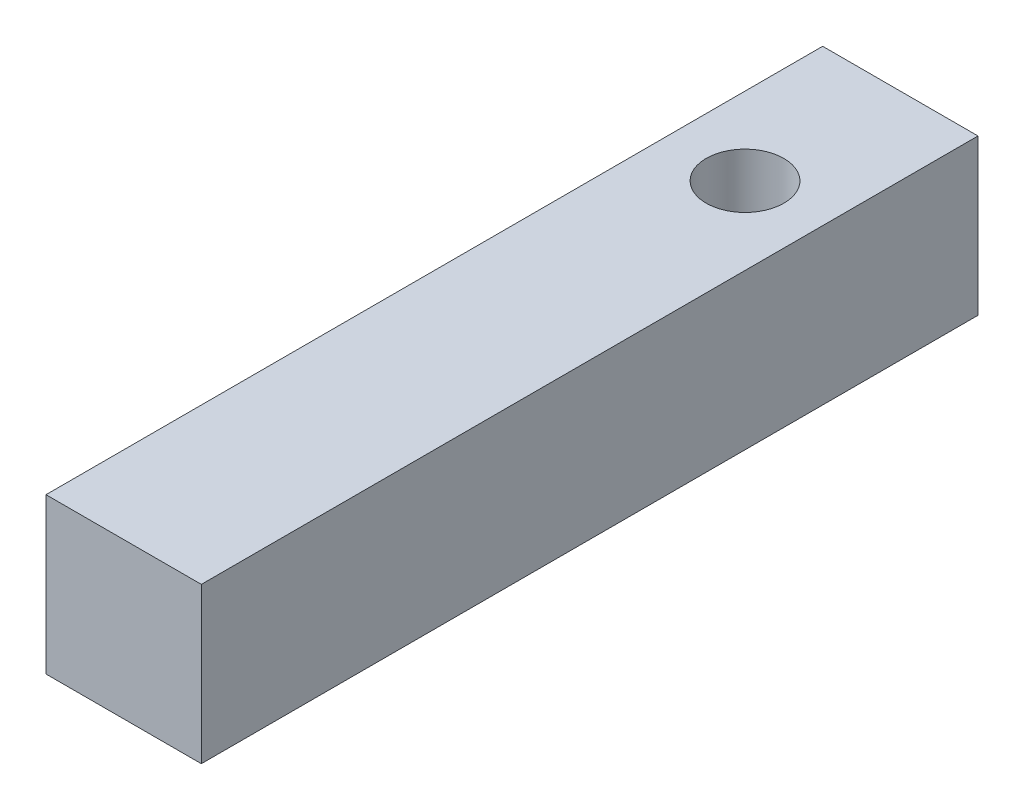
ISO-10303-21;
HEADER;
FILE_DESCRIPTION(('STEP AP214'),'2;1');
FILE_NAME('part.step','',(''),(''),'','','');
FILE_SCHEMA(('AUTOMOTIVE_DESIGN { 1 0 10303 214 1 1 1 1 }'));
ENDSEC;
DATA;
#1=APPLICATION_CONTEXT('core data for automotive mechanical design processes');
#2=APPLICATION_PROTOCOL_DEFINITION('international standard','automotive_design',2000,#1);
#3=PRODUCT_CONTEXT('',#1,'mechanical');
#4=PRODUCT('Part','Part','',(#3));
#5=PRODUCT_RELATED_PRODUCT_CATEGORY('part','',(#4));
#6=PRODUCT_DEFINITION_FORMATION('','',#4);
#7=PRODUCT_DEFINITION_CONTEXT('part definition',#1,'design');
#8=PRODUCT_DEFINITION('design','',#6,#7);
#9=PRODUCT_DEFINITION_SHAPE('','',#8);
#10=(LENGTH_UNIT() NAMED_UNIT(*) SI_UNIT(.MILLI.,.METRE.));
#11=(NAMED_UNIT(*) PLANE_ANGLE_UNIT() SI_UNIT($,.RADIAN.));
#12=(NAMED_UNIT(*) SI_UNIT($,.STERADIAN.) SOLID_ANGLE_UNIT());
#13=UNCERTAINTY_MEASURE_WITH_UNIT(LENGTH_MEASURE(1.E-05),#10,'distance_accuracy_value','');
#14=(GEOMETRIC_REPRESENTATION_CONTEXT(3) GLOBAL_UNCERTAINTY_ASSIGNED_CONTEXT((#13)) GLOBAL_UNIT_ASSIGNED_CONTEXT((#10,
#11,#12)) REPRESENTATION_CONTEXT('',''));
#15=CARTESIAN_POINT('',(0.,0.,0.));
#16=DIRECTION('',(0.,0.,1.));
#17=DIRECTION('',(1.,0.,0.));
#18=AXIS2_PLACEMENT_3D('',#15,#16,#17);
#19=CARTESIAN_POINT('',(15.,-15.,150.));
#20=DIRECTION('',(-1.,0.,0.));
#21=DIRECTION('',(0.,0.,1.));
#22=AXIS2_PLACEMENT_3D('',#19,#20,#21);
#23=PLANE('',#22);
#24=DIRECTION('',(0.,1.,0.));
#25=VECTOR('',#24,1.);
#26=CARTESIAN_POINT('',(15.,-15.,0.));
#27=LINE('',#26,#25);
#28=CARTESIAN_POINT('',(15.,-15.,0.));
#29=VERTEX_POINT('',#28);
#30=CARTESIAN_POINT('',(15.,15.,0.));
#31=VERTEX_POINT('',#30);
#32=EDGE_CURVE('E107',#29,#31,#27,.T.);
#33=ORIENTED_EDGE('',*,*,#32,.T.);
#34=DIRECTION('',(0.,0.,-1.));
#35=VECTOR('',#34,1.);
#36=CARTESIAN_POINT('',(15.,15.,150.));
#37=LINE('',#36,#35);
#38=CARTESIAN_POINT('',(15.,15.,150.));
#39=VERTEX_POINT('',#38);
#40=EDGE_CURVE('E11',#39,#31,#37,.T.);
#41=ORIENTED_EDGE('',*,*,#40,.F.);
#42=DIRECTION('',(0.,1.,0.));
#43=VECTOR('',#42,1.);
#44=CARTESIAN_POINT('',(15.,-15.,150.));
#45=LINE('',#44,#43);
#46=CARTESIAN_POINT('',(15.,-15.,150.));
#47=VERTEX_POINT('',#46);
#48=EDGE_CURVE('E91',#47,#39,#45,.T.);
#49=ORIENTED_EDGE('',*,*,#48,.F.);
#50=DIRECTION('',(0.,0.,-1.));
#51=VECTOR('',#50,1.);
#52=CARTESIAN_POINT('',(15.,-15.,150.));
#53=LINE('',#52,#51);
#54=EDGE_CURVE('E103',#47,#29,#53,.T.);
#55=ORIENTED_EDGE('',*,*,#54,.T.);
#56=EDGE_LOOP('',(#33,#41,#49,#55));
#57=FACE_BOUND('',#56,.T.);
#58=ADVANCED_FACE('F39',(#57),#23,.F.);
#59=CARTESIAN_POINT('',(-15.,15.,150.));
#60=DIRECTION('',(0.,-1.,0.));
#61=DIRECTION('',(0.,0.,-1.));
#62=AXIS2_PLACEMENT_3D('',#59,#60,#61);
#63=PLANE('',#62);
#64=CARTESIAN_POINT('',(0.,15.,30.));
#65=DIRECTION('',(0.,-1.,0.));
#66=DIRECTION('',(0.,0.,-1.));
#67=AXIS2_PLACEMENT_3D('',#64,#65,#66);
#68=CIRCLE('',#67,7.5);
#69=CARTESIAN_POINT('',(0.,15.,22.5));
#70=VERTEX_POINT('',#69);
#71=EDGE_CURVE('E111',#70,#70,#68,.T.);
#72=ORIENTED_EDGE('',*,*,#71,.T.);
#73=EDGE_LOOP('',(#72));
#74=FACE_BOUND('',#73,.T.);
#75=DIRECTION('',(-1.,0.,0.));
#76=VECTOR('',#75,1.);
#77=CARTESIAN_POINT('',(-15.,15.,0.));
#78=LINE('',#77,#76);
#79=CARTESIAN_POINT('',(-15.,15.,0.));
#80=VERTEX_POINT('',#79);
#81=EDGE_CURVE('E96',#31,#80,#78,.T.);
#82=ORIENTED_EDGE('',*,*,#81,.T.);
#83=DIRECTION('',(0.,0.,-1.));
#84=VECTOR('',#83,1.);
#85=CARTESIAN_POINT('',(-15.,15.,150.));
#86=LINE('',#85,#84);
#87=CARTESIAN_POINT('',(-15.,15.,150.));
#88=VERTEX_POINT('',#87);
#89=EDGE_CURVE('E48',#88,#80,#86,.T.);
#90=ORIENTED_EDGE('',*,*,#89,.F.);
#91=DIRECTION('',(-1.,0.,0.));
#92=VECTOR('',#91,1.);
#93=CARTESIAN_POINT('',(-15.,15.,150.));
#94=LINE('',#93,#92);
#95=EDGE_CURVE('E86',#39,#88,#94,.T.);
#96=ORIENTED_EDGE('',*,*,#95,.F.);
#97=ORIENTED_EDGE('',*,*,#40,.T.);
#98=EDGE_LOOP('',(#82,#90,#96,#97));
#99=FACE_BOUND('',#98,.T.);
#100=ADVANCED_FACE('F95',(#74,#99),#63,.F.);
#101=CARTESIAN_POINT('',(-15.,-15.,150.));
#102=DIRECTION('',(1.,0.,0.));
#103=DIRECTION('',(0.,0.,-1.));
#104=AXIS2_PLACEMENT_3D('',#101,#102,#103);
#105=PLANE('',#104);
#106=DIRECTION('',(0.,-1.,0.));
#107=VECTOR('',#106,1.);
#108=CARTESIAN_POINT('',(-15.,-15.,0.));
#109=LINE('',#108,#107);
#110=CARTESIAN_POINT('',(-15.,-15.,0.));
#111=VERTEX_POINT('',#110);
#112=EDGE_CURVE('E73',#80,#111,#109,.T.);
#113=ORIENTED_EDGE('',*,*,#112,.T.);
#114=DIRECTION('',(0.,0.,-1.));
#115=VECTOR('',#114,1.);
#116=CARTESIAN_POINT('',(-15.,-15.,150.));
#117=LINE('',#116,#115);
#118=CARTESIAN_POINT('',(-15.,-15.,150.));
#119=VERTEX_POINT('',#118);
#120=EDGE_CURVE('E98',#119,#111,#117,.T.);
#121=ORIENTED_EDGE('',*,*,#120,.F.);
#122=DIRECTION('',(0.,-1.,0.));
#123=VECTOR('',#122,1.);
#124=CARTESIAN_POINT('',(-15.,-15.,150.));
#125=LINE('',#124,#123);
#126=EDGE_CURVE('E89',#88,#119,#125,.T.);
#127=ORIENTED_EDGE('',*,*,#126,.F.);
#128=ORIENTED_EDGE('',*,*,#89,.T.);
#129=EDGE_LOOP('',(#113,#121,#127,#128));
#130=FACE_BOUND('',#129,.T.);
#131=ADVANCED_FACE('F99',(#130),#105,.F.);
#132=CARTESIAN_POINT('',(-15.,-15.,150.));
#133=DIRECTION('',(0.,1.,0.));
#134=DIRECTION('',(0.,0.,1.));
#135=AXIS2_PLACEMENT_3D('',#132,#133,#134);
#136=PLANE('',#135);
#137=CARTESIAN_POINT('',(0.,-15.,30.));
#138=DIRECTION('',(0.,-1.,0.));
#139=DIRECTION('',(0.,0.,-1.));
#140=AXIS2_PLACEMENT_3D('',#137,#138,#139);
#141=CIRCLE('',#140,7.5);
#142=CARTESIAN_POINT('',(0.,-15.,22.5));
#143=VERTEX_POINT('',#142);
#144=EDGE_CURVE('E131',#143,#143,#141,.T.);
#145=ORIENTED_EDGE('',*,*,#144,.F.);
#146=EDGE_LOOP('',(#145));
#147=FACE_BOUND('',#146,.T.);
#148=DIRECTION('',(1.,0.,0.));
#149=VECTOR('',#148,1.);
#150=CARTESIAN_POINT('',(-15.,-15.,0.));
#151=LINE('',#150,#149);
#152=EDGE_CURVE('E79',#111,#29,#151,.T.);
#153=ORIENTED_EDGE('',*,*,#152,.T.);
#154=ORIENTED_EDGE('',*,*,#54,.F.);
#155=DIRECTION('',(1.,0.,0.));
#156=VECTOR('',#155,1.);
#157=CARTESIAN_POINT('',(-15.,-15.,150.));
#158=LINE('',#157,#156);
#159=EDGE_CURVE('E56',#119,#47,#158,.T.);
#160=ORIENTED_EDGE('',*,*,#159,.F.);
#161=ORIENTED_EDGE('',*,*,#120,.T.);
#162=EDGE_LOOP('',(#153,#154,#160,#161));
#163=FACE_BOUND('',#162,.T.);
#164=ADVANCED_FACE('F121',(#147,#163),#136,.F.);
#165=CARTESIAN_POINT('',(0.,0.,150.));
#166=DIRECTION('',(0.,0.,-1.));
#167=DIRECTION('',(-1.,0.,0.));
#168=AXIS2_PLACEMENT_3D('',#165,#166,#167);
#169=PLANE('',#168);
#170=ORIENTED_EDGE('',*,*,#48,.T.);
#171=ORIENTED_EDGE('',*,*,#95,.T.);
#172=ORIENTED_EDGE('',*,*,#126,.T.);
#173=ORIENTED_EDGE('',*,*,#159,.T.);
#174=EDGE_LOOP('',(#170,#171,#172,#173));
#175=FACE_BOUND('',#174,.T.);
#176=ADVANCED_FACE('F87',(#175),#169,.F.);
#177=CARTESIAN_POINT('',(0.,0.,0.));
#178=DIRECTION('',(0.,0.,-1.));
#179=DIRECTION('',(-1.,0.,0.));
#180=AXIS2_PLACEMENT_3D('',#177,#178,#179);
#181=PLANE('',#180);
#182=ORIENTED_EDGE('',*,*,#32,.F.);
#183=ORIENTED_EDGE('',*,*,#152,.F.);
#184=ORIENTED_EDGE('',*,*,#112,.F.);
#185=ORIENTED_EDGE('',*,*,#81,.F.);
#186=EDGE_LOOP('',(#182,#183,#184,#185));
#187=FACE_BOUND('',#186,.T.);
#188=ADVANCED_FACE('F124',(#187),#181,.T.);
#189=CARTESIAN_POINT('',(0.,135.,30.));
#190=DIRECTION('',(0.,-1.,0.));
#191=DIRECTION('',(0.,0.,-1.));
#192=AXIS2_PLACEMENT_3D('',#189,#190,#191);
#193=CYLINDRICAL_SURFACE('',#192,7.5);
#194=ORIENTED_EDGE('',*,*,#144,.T.);
#195=EDGE_LOOP('',(#194));
#196=FACE_BOUND('',#195,.T.);
#197=ORIENTED_EDGE('',*,*,#71,.F.);
#198=EDGE_LOOP('',(#197));
#199=FACE_BOUND('',#198,.T.);
#200=ADVANCED_FACE('F136',(#196,#199),#193,.F.);
#201=CLOSED_SHELL('',(#58,#100,#131,#164,#176,#188,#200));
#202=MANIFOLD_SOLID_BREP('B2',#201);
#203=ADVANCED_BREP_SHAPE_REPRESENTATION('',(#18,#202),#14);
#204=SHAPE_DEFINITION_REPRESENTATION(#9,#203);
ENDSEC;
END-ISO-10303-21;
